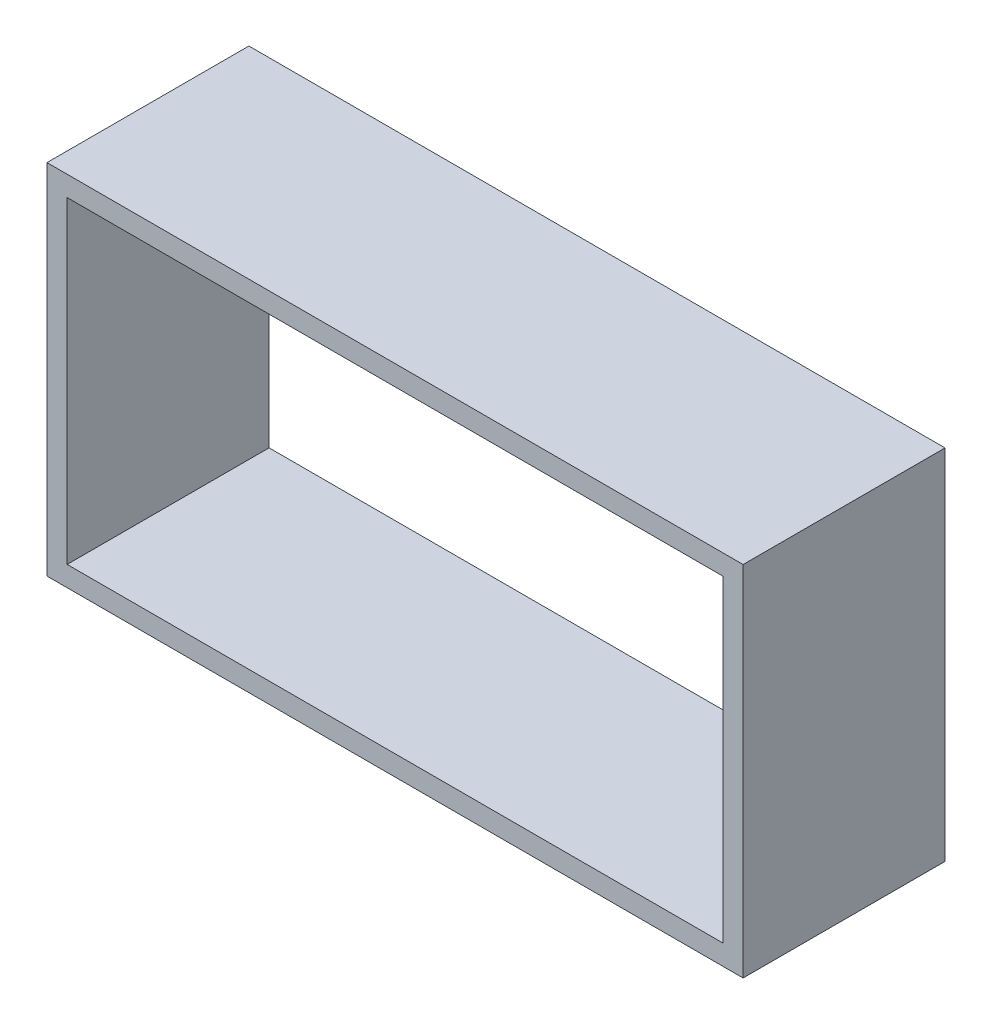
ISO-10303-21;
HEADER;
FILE_DESCRIPTION(('STEP AP214'),'2;1');
FILE_NAME('part.step','',(''),(''),'','','');
FILE_SCHEMA(('AUTOMOTIVE_DESIGN { 1 0 10303 214 1 1 1 1 }'));
ENDSEC;
DATA;
#1=APPLICATION_CONTEXT('core data for automotive mechanical design processes');
#2=APPLICATION_PROTOCOL_DEFINITION('international standard','automotive_design',2000,#1);
#3=PRODUCT_CONTEXT('',#1,'mechanical');
#4=PRODUCT('Part','Part','',(#3));
#5=PRODUCT_RELATED_PRODUCT_CATEGORY('part','',(#4));
#6=PRODUCT_DEFINITION_FORMATION('','',#4);
#7=PRODUCT_DEFINITION_CONTEXT('part definition',#1,'design');
#8=PRODUCT_DEFINITION('design','',#6,#7);
#9=PRODUCT_DEFINITION_SHAPE('','',#8);
#10=(LENGTH_UNIT() NAMED_UNIT(*) SI_UNIT(.MILLI.,.METRE.));
#11=(NAMED_UNIT(*) PLANE_ANGLE_UNIT() SI_UNIT($,.RADIAN.));
#12=(NAMED_UNIT(*) SI_UNIT($,.STERADIAN.) SOLID_ANGLE_UNIT());
#13=UNCERTAINTY_MEASURE_WITH_UNIT(LENGTH_MEASURE(1.E-05),#10,'distance_accuracy_value','');
#14=(GEOMETRIC_REPRESENTATION_CONTEXT(3) GLOBAL_UNCERTAINTY_ASSIGNED_CONTEXT((#13)) GLOBAL_UNIT_ASSIGNED_CONTEXT((#10,
#11,#12)) REPRESENTATION_CONTEXT('',''));
#15=CARTESIAN_POINT('',(0.,0.,0.));
#16=DIRECTION('',(0.,0.,1.));
#17=DIRECTION('',(1.,0.,0.));
#18=AXIS2_PLACEMENT_3D('',#15,#16,#17);
#19=CARTESIAN_POINT('',(0.,0.,25.4));
#20=DIRECTION('',(1.,0.,0.));
#21=DIRECTION('',(0.,0.,-1.));
#22=AXIS2_PLACEMENT_3D('',#19,#20,#21);
#23=PLANE('',#22);
#24=DIRECTION('',(0.,-1.,0.));
#25=VECTOR('',#24,1.);
#26=CARTESIAN_POINT('',(0.,0.,0.));
#27=LINE('',#26,#25);
#28=CARTESIAN_POINT('',(0.,45.0426110833229,0.));
#29=VERTEX_POINT('',#28);
#30=CARTESIAN_POINT('',(0.,0.,0.));
#31=VERTEX_POINT('',#30);
#32=EDGE_CURVE('E130',#29,#31,#27,.T.);
#33=ORIENTED_EDGE('',*,*,#32,.T.);
#34=DIRECTION('',(0.,0.,-1.));
#35=VECTOR('',#34,1.);
#36=CARTESIAN_POINT('',(0.,0.,25.4));
#37=LINE('',#36,#35);
#38=CARTESIAN_POINT('',(0.,0.,25.4));
#39=VERTEX_POINT('',#38);
#40=EDGE_CURVE('E11',#39,#31,#37,.T.);
#41=ORIENTED_EDGE('',*,*,#40,.F.);
#42=DIRECTION('',(0.,-1.,0.));
#43=VECTOR('',#42,1.);
#44=CARTESIAN_POINT('',(0.,0.,25.4));
#45=LINE('',#44,#43);
#46=CARTESIAN_POINT('',(0.,45.0426110833229,25.4));
#47=VERTEX_POINT('',#46);
#48=EDGE_CURVE('E134',#47,#39,#45,.T.);
#49=ORIENTED_EDGE('',*,*,#48,.F.);
#50=DIRECTION('',(0.,0.,-1.));
#51=VECTOR('',#50,1.);
#52=CARTESIAN_POINT('',(0.,45.0426110833229,25.4));
#53=LINE('',#52,#51);
#54=EDGE_CURVE('E144',#47,#29,#53,.T.);
#55=ORIENTED_EDGE('',*,*,#54,.T.);
#56=EDGE_LOOP('',(#33,#41,#49,#55));
#57=FACE_BOUND('',#56,.T.);
#58=ADVANCED_FACE('F33',(#57),#23,.F.);
#59=CARTESIAN_POINT('',(0.,0.,25.4));
#60=DIRECTION('',(0.,1.,0.));
#61=DIRECTION('',(0.,0.,1.));
#62=AXIS2_PLACEMENT_3D('',#59,#60,#61);
#63=PLANE('',#62);
#64=DIRECTION('',(1.,0.,0.));
#65=VECTOR('',#64,1.);
#66=CARTESIAN_POINT('',(0.,0.,0.));
#67=LINE('',#66,#65);
#68=CARTESIAN_POINT('',(87.5635315847609,0.,0.));
#69=VERTEX_POINT('',#68);
#70=EDGE_CURVE('E147',#31,#69,#67,.T.);
#71=ORIENTED_EDGE('',*,*,#70,.T.);
#72=DIRECTION('',(0.,0.,-1.));
#73=VECTOR('',#72,1.);
#74=CARTESIAN_POINT('',(87.5635315847609,0.,25.4));
#75=LINE('',#74,#73);
#76=CARTESIAN_POINT('',(87.5635315847609,0.,25.4));
#77=VERTEX_POINT('',#76);
#78=EDGE_CURVE('E40',#77,#69,#75,.T.);
#79=ORIENTED_EDGE('',*,*,#78,.F.);
#80=DIRECTION('',(1.,0.,0.));
#81=VECTOR('',#80,1.);
#82=CARTESIAN_POINT('',(0.,0.,25.4));
#83=LINE('',#82,#81);
#84=EDGE_CURVE('E137',#39,#77,#83,.T.);
#85=ORIENTED_EDGE('',*,*,#84,.F.);
#86=ORIENTED_EDGE('',*,*,#40,.T.);
#87=EDGE_LOOP('',(#71,#79,#85,#86));
#88=FACE_BOUND('',#87,.T.);
#89=ADVANCED_FACE('F175',(#88),#63,.F.);
#90=CARTESIAN_POINT('',(87.5635315847609,0.,25.4));
#91=DIRECTION('',(-1.,0.,0.));
#92=DIRECTION('',(0.,0.,1.));
#93=AXIS2_PLACEMENT_3D('',#90,#91,#92);
#94=PLANE('',#93);
#95=DIRECTION('',(0.,1.,0.));
#96=VECTOR('',#95,1.);
#97=CARTESIAN_POINT('',(87.5635315847609,0.,0.));
#98=LINE('',#97,#96);
#99=CARTESIAN_POINT('',(87.5635315847609,45.0426110833229,0.));
#100=VERTEX_POINT('',#99);
#101=EDGE_CURVE('E149',#69,#100,#98,.T.);
#102=ORIENTED_EDGE('',*,*,#101,.T.);
#103=DIRECTION('',(0.,0.,-1.));
#104=VECTOR('',#103,1.);
#105=CARTESIAN_POINT('',(87.5635315847609,45.0426110833229,25.4));
#106=LINE('',#105,#104);
#107=CARTESIAN_POINT('',(87.5635315847609,45.0426110833229,25.4));
#108=VERTEX_POINT('',#107);
#109=EDGE_CURVE('E154',#108,#100,#106,.T.);
#110=ORIENTED_EDGE('',*,*,#109,.F.);
#111=DIRECTION('',(0.,1.,0.));
#112=VECTOR('',#111,1.);
#113=CARTESIAN_POINT('',(87.5635315847609,0.,25.4));
#114=LINE('',#113,#112);
#115=EDGE_CURVE('E140',#77,#108,#114,.T.);
#116=ORIENTED_EDGE('',*,*,#115,.F.);
#117=ORIENTED_EDGE('',*,*,#78,.T.);
#118=EDGE_LOOP('',(#102,#110,#116,#117));
#119=FACE_BOUND('',#118,.T.);
#120=ADVANCED_FACE('F161',(#119),#94,.F.);
#121=CARTESIAN_POINT('',(0.,45.0426110833229,25.4));
#122=DIRECTION('',(0.,-1.,0.));
#123=DIRECTION('',(0.,0.,-1.));
#124=AXIS2_PLACEMENT_3D('',#121,#122,#123);
#125=PLANE('',#124);
#126=DIRECTION('',(-1.,0.,0.));
#127=VECTOR('',#126,1.);
#128=CARTESIAN_POINT('',(0.,45.0426110833229,0.));
#129=LINE('',#128,#127);
#130=EDGE_CURVE('E138',#100,#29,#129,.T.);
#131=ORIENTED_EDGE('',*,*,#130,.T.);
#132=ORIENTED_EDGE('',*,*,#54,.F.);
#133=DIRECTION('',(-1.,0.,0.));
#134=VECTOR('',#133,1.);
#135=CARTESIAN_POINT('',(0.,45.0426110833229,25.4));
#136=LINE('',#135,#134);
#137=EDGE_CURVE('E142',#108,#47,#136,.T.);
#138=ORIENTED_EDGE('',*,*,#137,.F.);
#139=ORIENTED_EDGE('',*,*,#109,.T.);
#140=EDGE_LOOP('',(#131,#132,#138,#139));
#141=FACE_BOUND('',#140,.T.);
#142=ADVANCED_FACE('F168',(#141),#125,.F.);
#143=CARTESIAN_POINT('',(0.,0.,25.4));
#144=DIRECTION('',(0.,0.,-1.));
#145=DIRECTION('',(-1.,0.,0.));
#146=AXIS2_PLACEMENT_3D('',#143,#144,#145);
#147=PLANE('',#146);
#148=DIRECTION('',(0.,-1.,0.));
#149=VECTOR('',#148,1.);
#150=CARTESIAN_POINT('',(2.54,42.5026110833229,25.4));
#151=LINE('',#150,#149);
#152=CARTESIAN_POINT('',(2.54,42.5026110833229,25.4));
#153=VERTEX_POINT('',#152);
#154=CARTESIAN_POINT('',(2.54,2.54,25.4));
#155=VERTEX_POINT('',#154);
#156=EDGE_CURVE('E124',#153,#155,#151,.T.);
#157=ORIENTED_EDGE('',*,*,#156,.F.);
#158=DIRECTION('',(-1.,0.,0.));
#159=VECTOR('',#158,1.);
#160=CARTESIAN_POINT('',(85.0235315847609,42.5026110833229,25.4));
#161=LINE('',#160,#159);
#162=CARTESIAN_POINT('',(85.0235315847609,42.5026110833229,25.4));
#163=VERTEX_POINT('',#162);
#164=EDGE_CURVE('E47',#163,#153,#161,.T.);
#165=ORIENTED_EDGE('',*,*,#164,.F.);
#166=DIRECTION('',(0.,1.,0.));
#167=VECTOR('',#166,1.);
#168=CARTESIAN_POINT('',(85.0235315847609,2.54,25.4));
#169=LINE('',#168,#167);
#170=CARTESIAN_POINT('',(85.0235315847609,2.54,25.4));
#171=VERTEX_POINT('',#170);
#172=EDGE_CURVE('E115',#171,#163,#169,.T.);
#173=ORIENTED_EDGE('',*,*,#172,.F.);
#174=DIRECTION('',(1.,0.,0.));
#175=VECTOR('',#174,1.);
#176=CARTESIAN_POINT('',(2.54,2.54,25.4));
#177=LINE('',#176,#175);
#178=EDGE_CURVE('E118',#155,#171,#177,.T.);
#179=ORIENTED_EDGE('',*,*,#178,.F.);
#180=EDGE_LOOP('',(#157,#165,#173,#179));
#181=FACE_BOUND('',#180,.T.);
#182=ORIENTED_EDGE('',*,*,#48,.T.);
#183=ORIENTED_EDGE('',*,*,#84,.T.);
#184=ORIENTED_EDGE('',*,*,#115,.T.);
#185=ORIENTED_EDGE('',*,*,#137,.T.);
#186=EDGE_LOOP('',(#182,#183,#184,#185));
#187=FACE_BOUND('',#186,.T.);
#188=ADVANCED_FACE('F174',(#181,#187),#147,.F.);
#189=CARTESIAN_POINT('',(0.,0.,0.));
#190=DIRECTION('',(0.,0.,-1.));
#191=DIRECTION('',(-1.,0.,0.));
#192=AXIS2_PLACEMENT_3D('',#189,#190,#191);
#193=PLANE('',#192);
#194=DIRECTION('',(-1.,0.,0.));
#195=VECTOR('',#194,1.);
#196=CARTESIAN_POINT('',(85.0235315847609,42.5026110833229,0.));
#197=LINE('',#196,#195);
#198=CARTESIAN_POINT('',(85.0235315847609,42.5026110833229,0.));
#199=VERTEX_POINT('',#198);
#200=CARTESIAN_POINT('',(2.54,42.5026110833229,0.));
#201=VERTEX_POINT('',#200);
#202=EDGE_CURVE('E99',#199,#201,#197,.T.);
#203=ORIENTED_EDGE('',*,*,#202,.T.);
#204=DIRECTION('',(0.,-1.,0.));
#205=VECTOR('',#204,1.);
#206=CARTESIAN_POINT('',(2.54,42.5026110833229,0.));
#207=LINE('',#206,#205);
#208=CARTESIAN_POINT('',(2.54,2.54,0.));
#209=VERTEX_POINT('',#208);
#210=EDGE_CURVE('E108',#201,#209,#207,.T.);
#211=ORIENTED_EDGE('',*,*,#210,.T.);
#212=DIRECTION('',(1.,0.,0.));
#213=VECTOR('',#212,1.);
#214=CARTESIAN_POINT('',(2.54,2.54,0.));
#215=LINE('',#214,#213);
#216=CARTESIAN_POINT('',(85.0235315847609,2.54,0.));
#217=VERTEX_POINT('',#216);
#218=EDGE_CURVE('E55',#209,#217,#215,.T.);
#219=ORIENTED_EDGE('',*,*,#218,.T.);
#220=DIRECTION('',(0.,1.,0.));
#221=VECTOR('',#220,1.);
#222=CARTESIAN_POINT('',(85.0235315847609,2.54,0.));
#223=LINE('',#222,#221);
#224=EDGE_CURVE('E105',#217,#199,#223,.T.);
#225=ORIENTED_EDGE('',*,*,#224,.T.);
#226=EDGE_LOOP('',(#203,#211,#219,#225));
#227=FACE_BOUND('',#226,.T.);
#228=ORIENTED_EDGE('',*,*,#32,.F.);
#229=ORIENTED_EDGE('',*,*,#130,.F.);
#230=ORIENTED_EDGE('',*,*,#101,.F.);
#231=ORIENTED_EDGE('',*,*,#70,.F.);
#232=EDGE_LOOP('',(#228,#229,#230,#231));
#233=FACE_BOUND('',#232,.T.);
#234=ADVANCED_FACE('F112',(#227,#233),#193,.T.);
#235=CARTESIAN_POINT('',(85.0235315847609,42.5026110833229,0.));
#236=DIRECTION('',(0.,1.,0.));
#237=DIRECTION('',(0.,0.,1.));
#238=AXIS2_PLACEMENT_3D('',#235,#236,#237);
#239=PLANE('',#238);
#240=ORIENTED_EDGE('',*,*,#164,.T.);
#241=DIRECTION('',(0.,0.,1.));
#242=VECTOR('',#241,1.);
#243=CARTESIAN_POINT('',(2.54,42.5026110833229,0.));
#244=LINE('',#243,#242);
#245=EDGE_CURVE('E95',#201,#153,#244,.T.);
#246=ORIENTED_EDGE('',*,*,#245,.F.);
#247=ORIENTED_EDGE('',*,*,#202,.F.);
#248=DIRECTION('',(0.,0.,1.));
#249=VECTOR('',#248,1.);
#250=CARTESIAN_POINT('',(85.0235315847609,42.5026110833229,0.));
#251=LINE('',#250,#249);
#252=EDGE_CURVE('E128',#199,#163,#251,.T.);
#253=ORIENTED_EDGE('',*,*,#252,.T.);
#254=EDGE_LOOP('',(#240,#246,#247,#253));
#255=FACE_BOUND('',#254,.T.);
#256=ADVANCED_FACE('F97',(#255),#239,.F.);
#257=CARTESIAN_POINT('',(85.0235315847609,2.54,0.));
#258=DIRECTION('',(1.,0.,0.));
#259=DIRECTION('',(0.,0.,-1.));
#260=AXIS2_PLACEMENT_3D('',#257,#258,#259);
#261=PLANE('',#260);
#262=ORIENTED_EDGE('',*,*,#172,.T.);
#263=ORIENTED_EDGE('',*,*,#252,.F.);
#264=ORIENTED_EDGE('',*,*,#224,.F.);
#265=DIRECTION('',(0.,0.,1.));
#266=VECTOR('',#265,1.);
#267=CARTESIAN_POINT('',(85.0235315847609,2.54,0.));
#268=LINE('',#267,#266);
#269=EDGE_CURVE('E131',#217,#171,#268,.T.);
#270=ORIENTED_EDGE('',*,*,#269,.T.);
#271=EDGE_LOOP('',(#262,#263,#264,#270));
#272=FACE_BOUND('',#271,.T.);
#273=ADVANCED_FACE('F192',(#272),#261,.F.);
#274=CARTESIAN_POINT('',(2.54,2.54,0.));
#275=DIRECTION('',(0.,-1.,0.));
#276=DIRECTION('',(0.,0.,-1.));
#277=AXIS2_PLACEMENT_3D('',#274,#275,#276);
#278=PLANE('',#277);
#279=ORIENTED_EDGE('',*,*,#178,.T.);
#280=ORIENTED_EDGE('',*,*,#269,.F.);
#281=ORIENTED_EDGE('',*,*,#218,.F.);
#282=DIRECTION('',(0.,0.,1.));
#283=VECTOR('',#282,1.);
#284=CARTESIAN_POINT('',(2.54,2.54,0.));
#285=LINE('',#284,#283);
#286=EDGE_CURVE('E104',#209,#155,#285,.T.);
#287=ORIENTED_EDGE('',*,*,#286,.T.);
#288=EDGE_LOOP('',(#279,#280,#281,#287));
#289=FACE_BOUND('',#288,.T.);
#290=ADVANCED_FACE('F195',(#289),#278,.F.);
#291=CARTESIAN_POINT('',(2.54,42.5026110833229,0.));
#292=DIRECTION('',(-1.,0.,0.));
#293=DIRECTION('',(0.,0.,1.));
#294=AXIS2_PLACEMENT_3D('',#291,#292,#293);
#295=PLANE('',#294);
#296=ORIENTED_EDGE('',*,*,#156,.T.);
#297=ORIENTED_EDGE('',*,*,#286,.F.);
#298=ORIENTED_EDGE('',*,*,#210,.F.);
#299=ORIENTED_EDGE('',*,*,#245,.T.);
#300=EDGE_LOOP('',(#296,#297,#298,#299));
#301=FACE_BOUND('',#300,.T.);
#302=ADVANCED_FACE('F109',(#301),#295,.F.);
#303=CLOSED_SHELL('',(#58,#89,#120,#142,#188,#234,#256,#273,#290,#302));
#304=MANIFOLD_SOLID_BREP('B2',#303);
#305=ADVANCED_BREP_SHAPE_REPRESENTATION('',(#18,#304),#14);
#306=SHAPE_DEFINITION_REPRESENTATION(#9,#305);
ENDSEC;
END-ISO-10303-21;
